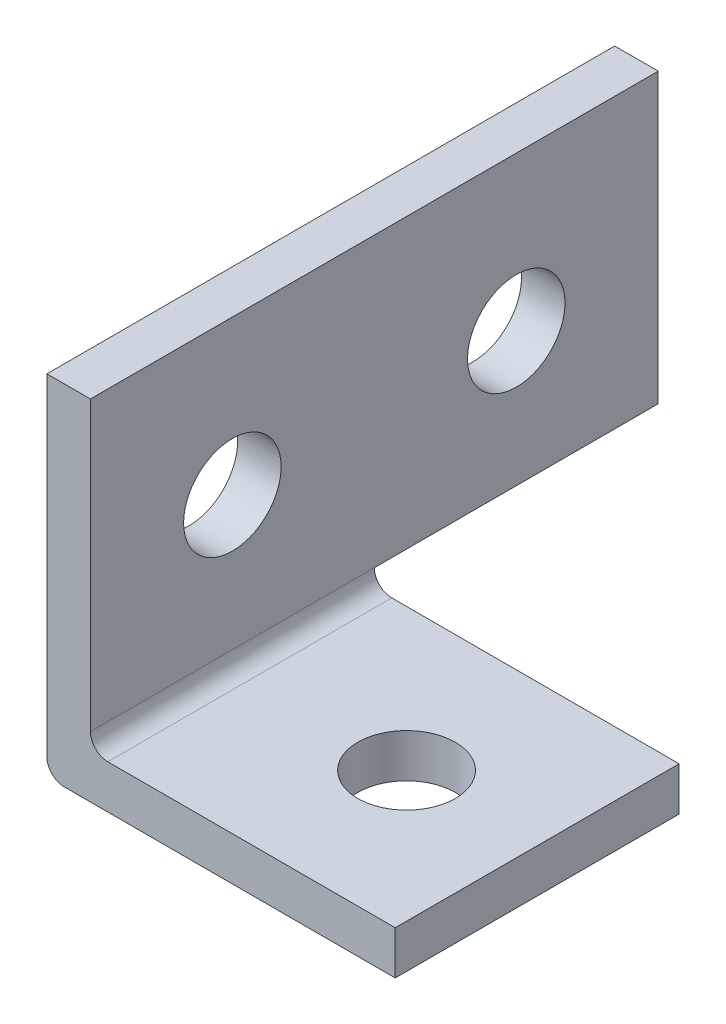
ISO-10303-21;
HEADER;
FILE_DESCRIPTION(('STEP AP214'),'2;1');
FILE_NAME('part.step','',(''),(''),'','','');
FILE_SCHEMA(('AUTOMOTIVE_DESIGN { 1 0 10303 214 1 1 1 1 }'));
ENDSEC;
DATA;
#1=APPLICATION_CONTEXT('core data for automotive mechanical design processes');
#2=APPLICATION_PROTOCOL_DEFINITION('international standard','automotive_design',2000,#1);
#3=PRODUCT_CONTEXT('',#1,'mechanical');
#4=PRODUCT('Part','Part','',(#3));
#5=PRODUCT_RELATED_PRODUCT_CATEGORY('part','',(#4));
#6=PRODUCT_DEFINITION_FORMATION('','',#4);
#7=PRODUCT_DEFINITION_CONTEXT('part definition',#1,'design');
#8=PRODUCT_DEFINITION('design','',#6,#7);
#9=PRODUCT_DEFINITION_SHAPE('','',#8);
#10=(LENGTH_UNIT() NAMED_UNIT(*) SI_UNIT(.MILLI.,.METRE.));
#11=(NAMED_UNIT(*) PLANE_ANGLE_UNIT() SI_UNIT($,.RADIAN.));
#12=(NAMED_UNIT(*) SI_UNIT($,.STERADIAN.) SOLID_ANGLE_UNIT());
#13=UNCERTAINTY_MEASURE_WITH_UNIT(LENGTH_MEASURE(1.E-05),#10,'distance_accuracy_value','');
#14=(GEOMETRIC_REPRESENTATION_CONTEXT(3) GLOBAL_UNCERTAINTY_ASSIGNED_CONTEXT((#13)) GLOBAL_UNIT_ASSIGNED_CONTEXT((#10,
#11,#12)) REPRESENTATION_CONTEXT('',''));
#15=CARTESIAN_POINT('',(0.,0.,0.));
#16=DIRECTION('',(0.,0.,1.));
#17=DIRECTION('',(1.,0.,0.));
#18=AXIS2_PLACEMENT_3D('',#15,#16,#17);
#19=CARTESIAN_POINT('',(50.8,0.,41.402));
#20=DIRECTION('',(-1.,0.,0.));
#21=DIRECTION('',(0.,0.,1.));
#22=AXIS2_PLACEMENT_3D('',#19,#20,#21);
#23=PLANE('',#22);
#24=DIRECTION('',(0.,1.,0.));
#25=VECTOR('',#24,1.);
#26=CARTESIAN_POINT('',(50.8,0.,0.));
#27=LINE('',#26,#25);
#28=CARTESIAN_POINT('',(50.8,0.,0.));
#29=VERTEX_POINT('',#28);
#30=CARTESIAN_POINT('',(50.8,6.35,0.));
#31=VERTEX_POINT('',#30);
#32=EDGE_CURVE('E130',#29,#31,#27,.T.);
#33=ORIENTED_EDGE('',*,*,#32,.T.);
#34=DIRECTION('',(0.,0.,-1.));
#35=VECTOR('',#34,1.);
#36=CARTESIAN_POINT('',(50.8,6.35,41.402));
#37=LINE('',#36,#35);
#38=CARTESIAN_POINT('',(50.8,6.35,41.402));
#39=VERTEX_POINT('',#38);
#40=EDGE_CURVE('E11',#39,#31,#37,.T.);
#41=ORIENTED_EDGE('',*,*,#40,.F.);
#42=DIRECTION('',(0.,1.,0.));
#43=VECTOR('',#42,1.);
#44=CARTESIAN_POINT('',(50.8,0.,41.402));
#45=LINE('',#44,#43);
#46=CARTESIAN_POINT('',(50.8,0.,41.402));
#47=VERTEX_POINT('',#46);
#48=EDGE_CURVE('E186',#47,#39,#45,.T.);
#49=ORIENTED_EDGE('',*,*,#48,.F.);
#50=DIRECTION('',(0.,0.,-1.));
#51=VECTOR('',#50,1.);
#52=CARTESIAN_POINT('',(50.8,0.,41.402));
#53=LINE('',#52,#51);
#54=EDGE_CURVE('E126',#47,#29,#53,.T.);
#55=ORIENTED_EDGE('',*,*,#54,.T.);
#56=EDGE_LOOP('',(#33,#41,#49,#55));
#57=FACE_BOUND('',#56,.T.);
#58=ADVANCED_FACE('F33',(#57),#23,.F.);
#59=CARTESIAN_POINT('',(50.8,6.35,41.402));
#60=DIRECTION('',(0.,-1.,0.));
#61=DIRECTION('',(1.,0.,0.));
#62=AXIS2_PLACEMENT_3D('',#59,#60,#61);
#63=PLANE('',#62);
#64=CARTESIAN_POINT('',(31.75,6.35,20.701));
#65=DIRECTION('',(0.,-1.,0.));
#66=DIRECTION('',(1.,0.,0.));
#67=AXIS2_PLACEMENT_3D('',#64,#65,#66);
#68=CIRCLE('',#67,7.112);
#69=CARTESIAN_POINT('',(31.75,6.35000000000001,13.589));
#70=VERTEX_POINT('',#69);
#71=EDGE_CURVE('E178',#70,#70,#68,.T.);
#72=ORIENTED_EDGE('',*,*,#71,.T.);
#73=EDGE_LOOP('',(#72));
#74=FACE_BOUND('',#73,.T.);
#75=DIRECTION('',(-1.,0.,0.));
#76=VECTOR('',#75,1.);
#77=CARTESIAN_POINT('',(50.8,6.35,0.));
#78=LINE('',#77,#76);
#79=CARTESIAN_POINT('',(8.89000000000002,6.35,0.));
#80=VERTEX_POINT('',#79);
#81=EDGE_CURVE('E133',#31,#80,#78,.T.);
#82=ORIENTED_EDGE('',*,*,#81,.T.);
#83=DIRECTION('',(0.,0.,-1.));
#84=VECTOR('',#83,1.);
#85=CARTESIAN_POINT('',(8.89000000000002,6.35,41.402));
#86=LINE('',#85,#84);
#87=CARTESIAN_POINT('',(8.89000000000002,6.35,41.402));
#88=VERTEX_POINT('',#87);
#89=EDGE_CURVE('E42',#88,#80,#86,.T.);
#90=ORIENTED_EDGE('',*,*,#89,.F.);
#91=DIRECTION('',(-1.,0.,0.));
#92=VECTOR('',#91,1.);
#93=CARTESIAN_POINT('',(50.8,6.35,41.402));
#94=LINE('',#93,#92);
#95=EDGE_CURVE('E89',#39,#88,#94,.T.);
#96=ORIENTED_EDGE('',*,*,#95,.F.);
#97=ORIENTED_EDGE('',*,*,#40,.T.);
#98=EDGE_LOOP('',(#82,#90,#96,#97));
#99=FACE_BOUND('',#98,.T.);
#100=ADVANCED_FACE('F238',(#74,#99),#63,.F.);
#101=CARTESIAN_POINT('',(8.89,8.89,41.402));
#102=DIRECTION('',(0.,0.,-1.));
#103=DIRECTION('',(-1.,0.,0.));
#104=AXIS2_PLACEMENT_3D('',#101,#102,#103);
#105=CYLINDRICAL_SURFACE('',#104,2.54);
#106=CARTESIAN_POINT('',(8.89,8.89,0.));
#107=DIRECTION('',(0.,0.,-1.));
#108=DIRECTION('',(1.,0.,0.));
#109=AXIS2_PLACEMENT_3D('',#106,#107,#108);
#110=CIRCLE('',#109,2.54);
#111=CARTESIAN_POINT('',(6.35,8.89000000000002,0.));
#112=VERTEX_POINT('',#111);
#113=EDGE_CURVE('E136',#80,#112,#110,.T.);
#114=ORIENTED_EDGE('',*,*,#113,.T.);
#115=DIRECTION('',(0.,0.,-1.));
#116=VECTOR('',#115,1.);
#117=CARTESIAN_POINT('',(6.35,8.89000000000002,41.402));
#118=LINE('',#117,#116);
#119=CARTESIAN_POINT('',(6.35,8.89000000000002,41.402));
#120=VERTEX_POINT('',#119);
#121=EDGE_CURVE('E201',#120,#112,#118,.T.);
#122=ORIENTED_EDGE('',*,*,#121,.F.);
#123=CARTESIAN_POINT('',(8.89,8.89,41.402));
#124=DIRECTION('',(0.,0.,-1.));
#125=DIRECTION('',(1.,0.,0.));
#126=AXIS2_PLACEMENT_3D('',#123,#124,#125);
#127=CIRCLE('',#126,2.54);
#128=EDGE_CURVE('E189',#88,#120,#127,.T.);
#129=ORIENTED_EDGE('',*,*,#128,.F.);
#130=ORIENTED_EDGE('',*,*,#89,.T.);
#131=EDGE_LOOP('',(#114,#122,#129,#130));
#132=FACE_BOUND('',#131,.T.);
#133=ADVANCED_FACE('F211',(#132),#105,.F.);
#134=CARTESIAN_POINT('',(6.35,50.9009802819273,41.402));
#135=DIRECTION('',(-1.,0.,0.));
#136=DIRECTION('',(0.,-1.,0.));
#137=AXIS2_PLACEMENT_3D('',#134,#135,#136);
#138=PLANE('',#137);
#139=CARTESIAN_POINT('',(6.35,28.448,-20.701));
#140=DIRECTION('',(1.,0.,0.));
#141=DIRECTION('',(0.,-1.,0.));
#142=AXIS2_PLACEMENT_3D('',#139,#140,#141);
#143=CIRCLE('',#142,7.112);
#144=CARTESIAN_POINT('',(6.35,21.336,-20.701));
#145=VERTEX_POINT('',#144);
#146=EDGE_CURVE('E363',#145,#145,#143,.T.);
#147=ORIENTED_EDGE('',*,*,#146,.F.);
#148=EDGE_LOOP('',(#147));
#149=FACE_BOUND('',#148,.T.);
#150=CARTESIAN_POINT('',(6.35,28.448,20.701));
#151=DIRECTION('',(-1.,0.,0.));
#152=DIRECTION('',(0.,-1.,0.));
#153=AXIS2_PLACEMENT_3D('',#150,#151,#152);
#154=CIRCLE('',#153,7.112);
#155=CARTESIAN_POINT('',(6.35,21.336,20.701));
#156=VERTEX_POINT('',#155);
#157=EDGE_CURVE('E134',#156,#156,#154,.T.);
#158=ORIENTED_EDGE('',*,*,#157,.T.);
#159=EDGE_LOOP('',(#158));
#160=FACE_BOUND('',#159,.T.);
#161=ORIENTED_EDGE('',*,*,#121,.T.);
#162=DIRECTION('',(0.,0.,-1.));
#163=VECTOR('',#162,1.);
#164=CARTESIAN_POINT('',(6.35,8.89000000000002,-41.402));
#165=LINE('',#164,#163);
#166=CARTESIAN_POINT('',(6.35,8.89000000000002,-41.402));
#167=VERTEX_POINT('',#166);
#168=EDGE_CURVE('E163',#112,#167,#165,.T.);
#169=ORIENTED_EDGE('',*,*,#168,.T.);
#170=DIRECTION('',(0.,1.,0.));
#171=VECTOR('',#170,1.);
#172=CARTESIAN_POINT('',(6.35,50.9009802819273,-41.402));
#173=LINE('',#172,#171);
#174=CARTESIAN_POINT('',(6.35,50.9009802819273,-41.402));
#175=VERTEX_POINT('',#174);
#176=EDGE_CURVE('E154',#167,#175,#173,.T.);
#177=ORIENTED_EDGE('',*,*,#176,.T.);
#178=DIRECTION('',(0.,0.,-1.));
#179=VECTOR('',#178,1.);
#180=CARTESIAN_POINT('',(6.35,50.9009802819273,41.402));
#181=LINE('',#180,#179);
#182=CARTESIAN_POINT('',(6.35,50.9009802819273,41.402));
#183=VERTEX_POINT('',#182);
#184=EDGE_CURVE('E197',#183,#175,#181,.T.);
#185=ORIENTED_EDGE('',*,*,#184,.F.);
#186=DIRECTION('',(0.,1.,0.));
#187=VECTOR('',#186,1.);
#188=CARTESIAN_POINT('',(6.35,50.9009802819273,41.402));
#189=LINE('',#188,#187);
#190=EDGE_CURVE('E191',#120,#183,#189,.T.);
#191=ORIENTED_EDGE('',*,*,#190,.F.);
#192=EDGE_LOOP('',(#161,#169,#177,#185,#191));
#193=FACE_BOUND('',#192,.T.);
#194=ADVANCED_FACE('F198',(#149,#160,#193),#138,.F.);
#195=CARTESIAN_POINT('',(0.,50.9009802819273,41.402));
#196=DIRECTION('',(0.,-1.,0.));
#197=DIRECTION('',(0.,0.,-1.));
#198=AXIS2_PLACEMENT_3D('',#195,#196,#197);
#199=PLANE('',#198);
#200=ORIENTED_EDGE('',*,*,#184,.T.);
#201=DIRECTION('',(1.,0.,0.));
#202=VECTOR('',#201,1.);
#203=CARTESIAN_POINT('',(0.,50.9009802819273,-41.402));
#204=LINE('',#203,#202);
#205=CARTESIAN_POINT('',(0.,50.9009802819273,-41.402));
#206=VERTEX_POINT('',#205);
#207=EDGE_CURVE('E171',#206,#175,#204,.T.);
#208=ORIENTED_EDGE('',*,*,#207,.F.);
#209=DIRECTION('',(0.,0.,-1.));
#210=VECTOR('',#209,1.);
#211=CARTESIAN_POINT('',(0.,50.9009802819273,41.402));
#212=LINE('',#211,#210);
#213=CARTESIAN_POINT('',(0.,50.9009802819273,41.402));
#214=VERTEX_POINT('',#213);
#215=EDGE_CURVE('E121',#214,#206,#212,.T.);
#216=ORIENTED_EDGE('',*,*,#215,.F.);
#217=DIRECTION('',(-1.,0.,0.));
#218=VECTOR('',#217,1.);
#219=CARTESIAN_POINT('',(0.,50.9009802819273,41.402));
#220=LINE('',#219,#218);
#221=EDGE_CURVE('E111',#183,#214,#220,.T.);
#222=ORIENTED_EDGE('',*,*,#221,.F.);
#223=EDGE_LOOP('',(#200,#208,#216,#222));
#224=FACE_BOUND('',#223,.T.);
#225=ADVANCED_FACE('F203',(#224),#199,.F.);
#226=CARTESIAN_POINT('',(0.,2.54000000000002,41.402));
#227=DIRECTION('',(1.,0.,0.));
#228=DIRECTION('',(0.,0.,-1.));
#229=AXIS2_PLACEMENT_3D('',#226,#227,#228);
#230=PLANE('',#229);
#231=CARTESIAN_POINT('',(0.,28.448,-20.701));
#232=DIRECTION('',(1.,0.,0.));
#233=DIRECTION('',(0.,0.,-1.));
#234=AXIS2_PLACEMENT_3D('',#231,#232,#233);
#235=CIRCLE('',#234,7.112);
#236=CARTESIAN_POINT('',(0.,28.448,-27.813));
#237=VERTEX_POINT('',#236);
#238=EDGE_CURVE('E36',#237,#237,#235,.T.);
#239=ORIENTED_EDGE('',*,*,#238,.T.);
#240=EDGE_LOOP('',(#239));
#241=FACE_BOUND('',#240,.T.);
#242=CARTESIAN_POINT('',(0.,28.448,20.701));
#243=DIRECTION('',(-1.,0.,0.));
#244=DIRECTION('',(0.,0.,1.));
#245=AXIS2_PLACEMENT_3D('',#242,#243,#244);
#246=CIRCLE('',#245,7.112);
#247=CARTESIAN_POINT('',(0.,28.448,27.813));
#248=VERTEX_POINT('',#247);
#249=EDGE_CURVE('E181',#248,#248,#246,.T.);
#250=ORIENTED_EDGE('',*,*,#249,.F.);
#251=EDGE_LOOP('',(#250));
#252=FACE_BOUND('',#251,.T.);
#253=ORIENTED_EDGE('',*,*,#215,.T.);
#254=DIRECTION('',(0.,1.,0.));
#255=VECTOR('',#254,1.);
#256=CARTESIAN_POINT('',(0.,50.9009802819273,-41.402));
#257=LINE('',#256,#255);
#258=CARTESIAN_POINT('',(0.,8.89000000000002,-41.402));
#259=VERTEX_POINT('',#258);
#260=EDGE_CURVE('E149',#259,#206,#257,.T.);
#261=ORIENTED_EDGE('',*,*,#260,.F.);
#262=DIRECTION('',(0.,0.,-1.));
#263=VECTOR('',#262,1.);
#264=CARTESIAN_POINT('',(0.,8.89000000000002,-41.402));
#265=LINE('',#264,#263);
#266=CARTESIAN_POINT('',(0.,8.89000000000002,0.));
#267=VERTEX_POINT('',#266);
#268=EDGE_CURVE('E152',#267,#259,#265,.T.);
#269=ORIENTED_EDGE('',*,*,#268,.F.);
#270=DIRECTION('',(0.,-1.,0.));
#271=VECTOR('',#270,1.);
#272=CARTESIAN_POINT('',(0.,2.54000000000002,0.));
#273=LINE('',#272,#271);
#274=CARTESIAN_POINT('',(0.,2.54000000000002,0.));
#275=VERTEX_POINT('',#274);
#276=EDGE_CURVE('E120',#267,#275,#273,.T.);
#277=ORIENTED_EDGE('',*,*,#276,.T.);
#278=DIRECTION('',(0.,0.,-1.));
#279=VECTOR('',#278,1.);
#280=CARTESIAN_POINT('',(0.,2.54000000000002,41.402));
#281=LINE('',#280,#279);
#282=CARTESIAN_POINT('',(0.,2.54000000000002,41.402));
#283=VERTEX_POINT('',#282);
#284=EDGE_CURVE('E116',#283,#275,#281,.T.);
#285=ORIENTED_EDGE('',*,*,#284,.F.);
#286=DIRECTION('',(0.,-1.,0.));
#287=VECTOR('',#286,1.);
#288=CARTESIAN_POINT('',(0.,2.54000000000002,41.402));
#289=LINE('',#288,#287);
#290=EDGE_CURVE('E105',#214,#283,#289,.T.);
#291=ORIENTED_EDGE('',*,*,#290,.F.);
#292=EDGE_LOOP('',(#253,#261,#269,#277,#285,#291));
#293=FACE_BOUND('',#292,.T.);
#294=ADVANCED_FACE('F117',(#241,#252,#293),#230,.F.);
#295=CARTESIAN_POINT('',(2.54,2.54,41.402));
#296=DIRECTION('',(0.,0.,-1.));
#297=DIRECTION('',(-1.,0.,0.));
#298=AXIS2_PLACEMENT_3D('',#295,#296,#297);
#299=CYLINDRICAL_SURFACE('',#298,2.54);
#300=CARTESIAN_POINT('',(2.54,2.54,0.));
#301=DIRECTION('',(0.,0.,1.));
#302=DIRECTION('',(1.,0.,0.));
#303=AXIS2_PLACEMENT_3D('',#300,#301,#302);
#304=CIRCLE('',#303,2.54);
#305=CARTESIAN_POINT('',(2.54000000000002,0.,0.));
#306=VERTEX_POINT('',#305);
#307=EDGE_CURVE('E75',#275,#306,#304,.T.);
#308=ORIENTED_EDGE('',*,*,#307,.T.);
#309=DIRECTION('',(0.,0.,-1.));
#310=VECTOR('',#309,1.);
#311=CARTESIAN_POINT('',(2.54000000000002,0.,41.402));
#312=LINE('',#311,#310);
#313=CARTESIAN_POINT('',(2.54000000000002,0.,41.402));
#314=VERTEX_POINT('',#313);
#315=EDGE_CURVE('E122',#314,#306,#312,.T.);
#316=ORIENTED_EDGE('',*,*,#315,.F.);
#317=CARTESIAN_POINT('',(2.54,2.54,41.402));
#318=DIRECTION('',(0.,0.,1.));
#319=DIRECTION('',(1.,0.,0.));
#320=AXIS2_PLACEMENT_3D('',#317,#318,#319);
#321=CIRCLE('',#320,2.54);
#322=EDGE_CURVE('E109',#283,#314,#321,.T.);
#323=ORIENTED_EDGE('',*,*,#322,.F.);
#324=ORIENTED_EDGE('',*,*,#284,.T.);
#325=EDGE_LOOP('',(#308,#316,#323,#324));
#326=FACE_BOUND('',#325,.T.);
#327=ADVANCED_FACE('F124',(#326),#299,.T.);
#328=CARTESIAN_POINT('',(2.54000000000002,0.,41.402));
#329=DIRECTION('',(0.,1.,0.));
#330=DIRECTION('',(0.,0.,1.));
#331=AXIS2_PLACEMENT_3D('',#328,#329,#330);
#332=PLANE('',#331);
#333=CARTESIAN_POINT('',(31.75,0.,20.701));
#334=DIRECTION('',(0.,-1.,0.));
#335=DIRECTION('',(0.,0.,-1.));
#336=AXIS2_PLACEMENT_3D('',#333,#334,#335);
#337=CIRCLE('',#336,7.112);
#338=CARTESIAN_POINT('',(31.75,0.,13.589));
#339=VERTEX_POINT('',#338);
#340=EDGE_CURVE('E174',#339,#339,#337,.T.);
#341=ORIENTED_EDGE('',*,*,#340,.F.);
#342=EDGE_LOOP('',(#341));
#343=FACE_BOUND('',#342,.T.);
#344=DIRECTION('',(1.,0.,0.));
#345=VECTOR('',#344,1.);
#346=CARTESIAN_POINT('',(2.54000000000002,0.,0.));
#347=LINE('',#346,#345);
#348=EDGE_CURVE('E81',#306,#29,#347,.T.);
#349=ORIENTED_EDGE('',*,*,#348,.T.);
#350=ORIENTED_EDGE('',*,*,#54,.F.);
#351=DIRECTION('',(1.,0.,0.));
#352=VECTOR('',#351,1.);
#353=CARTESIAN_POINT('',(2.54000000000002,0.,41.402));
#354=LINE('',#353,#352);
#355=EDGE_CURVE('E51',#314,#47,#354,.T.);
#356=ORIENTED_EDGE('',*,*,#355,.F.);
#357=ORIENTED_EDGE('',*,*,#315,.T.);
#358=EDGE_LOOP('',(#349,#350,#356,#357));
#359=FACE_BOUND('',#358,.T.);
#360=ADVANCED_FACE('F247',(#343,#359),#332,.F.);
#361=CARTESIAN_POINT('',(8.89,8.89,41.402));
#362=DIRECTION('',(0.,0.,1.));
#363=DIRECTION('',(1.,0.,0.));
#364=AXIS2_PLACEMENT_3D('',#361,#362,#363);
#365=PLANE('',#364);
#366=ORIENTED_EDGE('',*,*,#48,.T.);
#367=ORIENTED_EDGE('',*,*,#95,.T.);
#368=ORIENTED_EDGE('',*,*,#128,.T.);
#369=ORIENTED_EDGE('',*,*,#190,.T.);
#370=ORIENTED_EDGE('',*,*,#221,.T.);
#371=ORIENTED_EDGE('',*,*,#290,.T.);
#372=ORIENTED_EDGE('',*,*,#322,.T.);
#373=ORIENTED_EDGE('',*,*,#355,.T.);
#374=EDGE_LOOP('',(#366,#367,#368,#369,#370,#371,#372,#373));
#375=FACE_BOUND('',#374,.T.);
#376=ADVANCED_FACE('F107',(#375),#365,.T.);
#377=CARTESIAN_POINT('',(8.89,8.89,0.));
#378=DIRECTION('',(0.,0.,1.));
#379=DIRECTION('',(1.,0.,0.));
#380=AXIS2_PLACEMENT_3D('',#377,#378,#379);
#381=PLANE('',#380);
#382=ORIENTED_EDGE('',*,*,#276,.F.);
#383=DIRECTION('',(1.,0.,0.));
#384=VECTOR('',#383,1.);
#385=CARTESIAN_POINT('',(0.,8.89000000000002,0.));
#386=LINE('',#385,#384);
#387=EDGE_CURVE('E145',#267,#112,#386,.T.);
#388=ORIENTED_EDGE('',*,*,#387,.T.);
#389=ORIENTED_EDGE('',*,*,#113,.F.);
#390=ORIENTED_EDGE('',*,*,#81,.F.);
#391=ORIENTED_EDGE('',*,*,#32,.F.);
#392=ORIENTED_EDGE('',*,*,#348,.F.);
#393=ORIENTED_EDGE('',*,*,#307,.F.);
#394=EDGE_LOOP('',(#382,#388,#389,#390,#391,#392,#393));
#395=FACE_BOUND('',#394,.T.);
#396=ADVANCED_FACE('F213',(#395),#381,.F.);
#397=CARTESIAN_POINT('',(50.8,28.448,20.701));
#398=DIRECTION('',(-1.,0.,0.));
#399=DIRECTION('',(0.,0.,1.));
#400=AXIS2_PLACEMENT_3D('',#397,#398,#399);
#401=CYLINDRICAL_SURFACE('',#400,7.112);
#402=ORIENTED_EDGE('',*,*,#249,.T.);
#403=EDGE_LOOP('',(#402));
#404=FACE_BOUND('',#403,.T.);
#405=ORIENTED_EDGE('',*,*,#157,.F.);
#406=EDGE_LOOP('',(#405));
#407=FACE_BOUND('',#406,.T.);
#408=ADVANCED_FACE('F233',(#404,#407),#401,.F.);
#409=CARTESIAN_POINT('',(31.75,50.9009802819273,20.701));
#410=DIRECTION('',(0.,-1.,0.));
#411=DIRECTION('',(0.,0.,-1.));
#412=AXIS2_PLACEMENT_3D('',#409,#410,#411);
#413=CYLINDRICAL_SURFACE('',#412,7.112);
#414=CARTESIAN_POINT('',(31.75,0.,13.589));
#415=CARTESIAN_POINT('',(31.75,0.0661458333333341,13.589));
#416=CARTESIAN_POINT('',(31.75,0.132291666666668,13.589));
#417=CARTESIAN_POINT('',(31.75,0.264583333333334,13.589));
#418=CARTESIAN_POINT('',(31.75,0.330729166666666,13.589));
#419=CARTESIAN_POINT('',(31.75,0.463020833333332,13.589));
#420=CARTESIAN_POINT('',(31.75,0.529166666666666,13.589));
#421=CARTESIAN_POINT('',(31.75,0.661458333333334,13.589));
#422=CARTESIAN_POINT('',(31.75,0.727604166666669,13.589));
#423=CARTESIAN_POINT('',(31.75,0.859895833333335,13.589));
#424=CARTESIAN_POINT('',(31.75,0.926041666666666,13.589));
#425=CARTESIAN_POINT('',(31.75,1.05833333333333,13.589));
#426=CARTESIAN_POINT('',(31.75,1.12447916666667,13.589));
#427=CARTESIAN_POINT('',(31.75,1.25677083333333,13.589));
#428=CARTESIAN_POINT('',(31.75,1.32291666666667,13.589));
#429=CARTESIAN_POINT('',(31.75,1.45520833333334,13.589));
#430=CARTESIAN_POINT('',(31.75,1.52135416666667,13.589));
#431=CARTESIAN_POINT('',(31.75,1.65364583333334,13.589));
#432=CARTESIAN_POINT('',(31.75,1.71979166666667,13.589));
#433=CARTESIAN_POINT('',(31.75,1.85208333333334,13.589));
#434=CARTESIAN_POINT('',(31.75,1.91822916666667,13.589));
#435=CARTESIAN_POINT('',(31.75,2.05052083333334,13.589));
#436=CARTESIAN_POINT('',(31.75,2.11666666666667,13.589));
#437=CARTESIAN_POINT('',(31.75,2.24895833333334,13.589));
#438=CARTESIAN_POINT('',(31.75,2.31510416666667,13.589));
#439=CARTESIAN_POINT('',(31.75,2.44739583333334,13.589));
#440=CARTESIAN_POINT('',(31.75,2.51354166666667,13.589));
#441=CARTESIAN_POINT('',(31.75,2.64583333333334,13.589));
#442=CARTESIAN_POINT('',(31.75,2.71197916666667,13.589));
#443=CARTESIAN_POINT('',(31.75,2.84427083333334,13.589));
#444=CARTESIAN_POINT('',(31.75,2.91041666666667,13.589));
#445=CARTESIAN_POINT('',(31.75,3.04270833333334,13.589));
#446=CARTESIAN_POINT('',(31.75,3.10885416666667,13.589));
#447=CARTESIAN_POINT('',(31.75,3.24114583333334,13.589));
#448=CARTESIAN_POINT('',(31.75,3.30729166666667,13.589));
#449=CARTESIAN_POINT('',(31.75,3.43958333333334,13.589));
#450=CARTESIAN_POINT('',(31.75,3.50572916666667,13.589));
#451=CARTESIAN_POINT('',(31.75,3.63802083333334,13.589));
#452=CARTESIAN_POINT('',(31.75,3.70416666666667,13.589));
#453=CARTESIAN_POINT('',(31.75,3.83645833333334,13.589));
#454=CARTESIAN_POINT('',(31.75,3.90260416666667,13.589));
#455=CARTESIAN_POINT('',(31.75,4.03489583333334,13.589));
#456=CARTESIAN_POINT('',(31.75,4.10104166666667,13.589));
#457=CARTESIAN_POINT('',(31.75,4.23333333333334,13.589));
#458=CARTESIAN_POINT('',(31.75,4.29947916666667,13.589));
#459=CARTESIAN_POINT('',(31.75,4.43177083333334,13.589));
#460=CARTESIAN_POINT('',(31.75,4.49791666666667,13.589));
#461=CARTESIAN_POINT('',(31.75,4.63020833333334,13.589));
#462=CARTESIAN_POINT('',(31.75,4.69635416666667,13.589));
#463=CARTESIAN_POINT('',(31.75,4.82864583333334,13.589));
#464=CARTESIAN_POINT('',(31.75,4.89479166666667,13.589));
#465=CARTESIAN_POINT('',(31.75,5.02708333333334,13.589));
#466=CARTESIAN_POINT('',(31.75,5.09322916666667,13.589));
#467=CARTESIAN_POINT('',(31.75,5.22552083333334,13.589));
#468=CARTESIAN_POINT('',(31.75,5.29166666666667,13.589));
#469=CARTESIAN_POINT('',(31.75,5.42395833333334,13.589));
#470=CARTESIAN_POINT('',(31.75,5.49010416666667,13.589));
#471=CARTESIAN_POINT('',(31.75,5.62239583333334,13.589));
#472=CARTESIAN_POINT('',(31.75,5.68854166666667,13.589));
#473=CARTESIAN_POINT('',(31.75,5.82083333333334,13.589));
#474=CARTESIAN_POINT('',(31.75,5.88697916666668,13.589));
#475=CARTESIAN_POINT('',(31.75,6.01927083333334,13.589));
#476=CARTESIAN_POINT('',(31.75,6.08541666666667,13.589));
#477=CARTESIAN_POINT('',(31.75,6.21770833333334,13.589));
#478=CARTESIAN_POINT('',(31.75,6.28385416666667,13.589));
#479=CARTESIAN_POINT('',(31.75,6.35000000000001,13.589));
#480=B_SPLINE_CURVE_WITH_KNOTS('',3,(#414,#415,#416,#417,#418,#419,#420,#421,#422,#423,#424,
#425,#426,#427,#428,#429,#430,#431,#432,#433,#434,#435,#436,#437,#438,#439,#440,#441,#442,#443,
#444,#445,#446,#447,#448,#449,#450,#451,#452,#453,#454,#455,#456,#457,#458,#459,#460,#461,#462,
#463,#464,#465,#466,#467,#468,#469,#470,#471,#472,#473,#474,#475,#476,#477,#478,#479),
.UNSPECIFIED.,.F.,.F.,(4,2,2,2,2,2,2,2,2,2,2,2,2,2,2,2,2,2,2,2,2,2,2,2,2,2,2,2,2,2,2,2,4),(0.,
0.198437500000002,0.396874999999998,0.5953125,0.793750000000003,0.992187499999998,1.190625,
1.3890625,1.58750000000001,1.7859375,1.984375,2.18281250000001,2.38125,2.5796875,
2.77812500000001,2.9765625,3.175,3.37343750000001,3.571875,3.7703125,3.96875000000001,4.1671875,
4.365625,4.56406250000001,4.7625,4.96093750000001,5.15937500000001,5.3578125,5.55625000000001,
5.75468750000001,5.95312500000001,6.15156250000001,6.35000000000001),.UNSPECIFIED.);
#481=EDGE_CURVE('BSEAM225',#339,#70,#480,.T.);
#482=ORIENTED_EDGE('',*,*,#340,.T.);
#483=ORIENTED_EDGE('',*,*,#71,.F.);
#484=ORIENTED_EDGE('',*,*,#481,.T.);
#485=ORIENTED_EDGE('',*,*,#481,.F.);
#486=EDGE_LOOP('',(#482,#484,#483,#485));
#487=FACE_BOUND('',#486,.T.);
#488=ADVANCED_FACE('F225',(#487),#413,.F.);
#489=CARTESIAN_POINT('',(0.,50.9009802819273,-41.402));
#490=DIRECTION('',(0.,0.,-1.));
#491=DIRECTION('',(-1.,0.,0.));
#492=AXIS2_PLACEMENT_3D('',#489,#490,#491);
#493=PLANE('',#492);
#494=ORIENTED_EDGE('',*,*,#176,.F.);
#495=DIRECTION('',(1.,0.,0.));
#496=VECTOR('',#495,1.);
#497=CARTESIAN_POINT('',(0.,8.89000000000002,-41.402));
#498=LINE('',#497,#496);
#499=EDGE_CURVE('E148',#259,#167,#498,.T.);
#500=ORIENTED_EDGE('',*,*,#499,.F.);
#501=ORIENTED_EDGE('',*,*,#260,.T.);
#502=ORIENTED_EDGE('',*,*,#207,.T.);
#503=EDGE_LOOP('',(#494,#500,#501,#502));
#504=FACE_BOUND('',#503,.T.);
#505=ADVANCED_FACE('F221',(#504),#493,.T.);
#506=CARTESIAN_POINT('',(0.,8.89000000000002,-41.402));
#507=DIRECTION('',(0.,-1.,0.));
#508=DIRECTION('',(1.,0.,0.));
#509=AXIS2_PLACEMENT_3D('',#506,#507,#508);
#510=PLANE('',#509);
#511=ORIENTED_EDGE('',*,*,#168,.F.);
#512=ORIENTED_EDGE('',*,*,#387,.F.);
#513=ORIENTED_EDGE('',*,*,#268,.T.);
#514=ORIENTED_EDGE('',*,*,#499,.T.);
#515=EDGE_LOOP('',(#511,#512,#513,#514));
#516=FACE_BOUND('',#515,.T.);
#517=ADVANCED_FACE('F216',(#516),#510,.T.);
#518=CARTESIAN_POINT('',(-4.99999999997031E-05,28.448,-20.701));
#519=DIRECTION('',(1.,0.,0.));
#520=DIRECTION('',(0.,1.,0.));
#521=AXIS2_PLACEMENT_3D('',#518,#519,#520);
#522=CYLINDRICAL_SURFACE('',#521,7.112);
#523=ORIENTED_EDGE('',*,*,#146,.T.);
#524=EDGE_LOOP('',(#523));
#525=FACE_BOUND('',#524,.T.);
#526=ORIENTED_EDGE('',*,*,#238,.F.);
#527=EDGE_LOOP('',(#526));
#528=FACE_BOUND('',#527,.T.);
#529=ADVANCED_FACE('F231',(#525,#528),#522,.F.);
#530=CLOSED_SHELL('',(#58,#100,#133,#194,#225,#294,#327,#360,#376,#396,#408,#488,#505,#517,#529));
#531=MANIFOLD_SOLID_BREP('B2',#530);
#532=ADVANCED_BREP_SHAPE_REPRESENTATION('',(#18,#531),#14);
#533=SHAPE_DEFINITION_REPRESENTATION(#9,#532);
ENDSEC;
END-ISO-10303-21;
